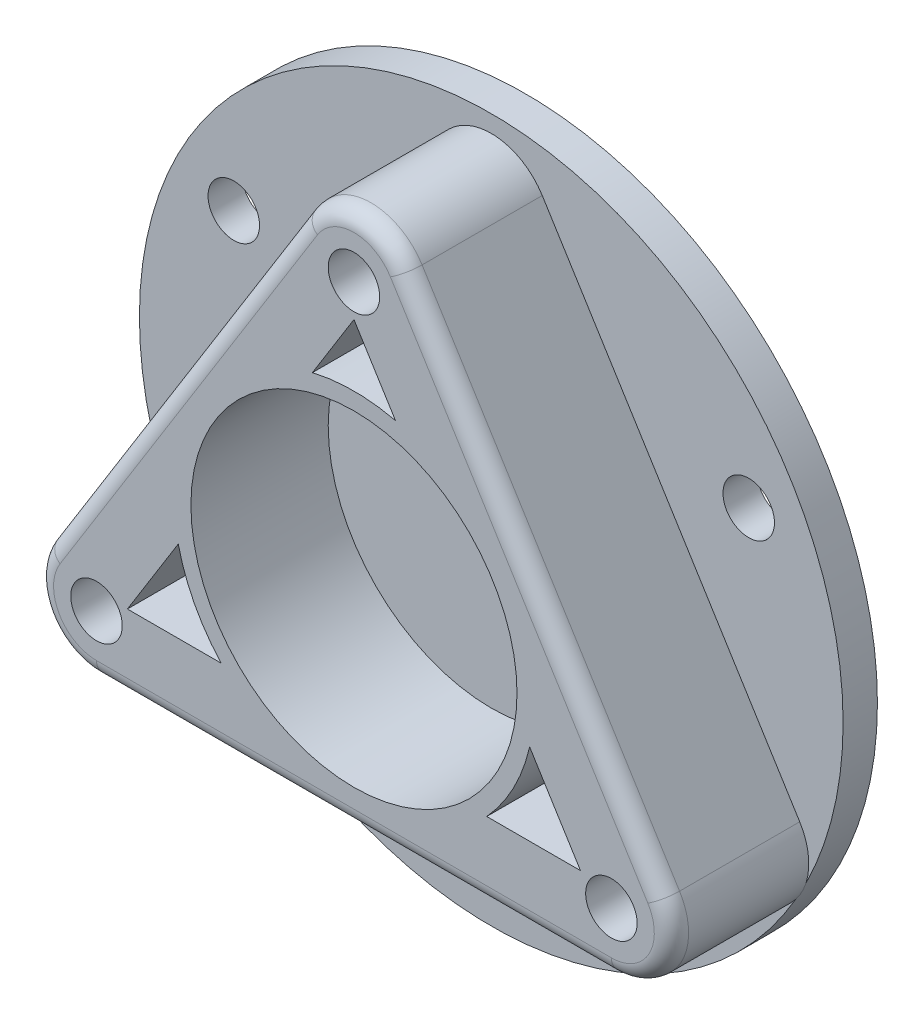
ISO-10303-21;
HEADER;
FILE_DESCRIPTION(('STEP AP214'),'2;1');
FILE_NAME('part.step','',(''),(''),'','','');
FILE_SCHEMA(('AUTOMOTIVE_DESIGN { 1 0 10303 214 1 1 1 1 }'));
ENDSEC;
DATA;
#1=APPLICATION_CONTEXT('core data for automotive mechanical design processes');
#2=APPLICATION_PROTOCOL_DEFINITION('international standard','automotive_design',2000,#1);
#3=PRODUCT_CONTEXT('',#1,'mechanical');
#4=PRODUCT('Part','Part','',(#3));
#5=PRODUCT_RELATED_PRODUCT_CATEGORY('part','',(#4));
#6=PRODUCT_DEFINITION_FORMATION('','',#4);
#7=PRODUCT_DEFINITION_CONTEXT('part definition',#1,'design');
#8=PRODUCT_DEFINITION('design','',#6,#7);
#9=PRODUCT_DEFINITION_SHAPE('','',#8);
#10=(LENGTH_UNIT() NAMED_UNIT(*) SI_UNIT(.MILLI.,.METRE.));
#11=(NAMED_UNIT(*) PLANE_ANGLE_UNIT() SI_UNIT($,.RADIAN.));
#12=(NAMED_UNIT(*) SI_UNIT($,.STERADIAN.) SOLID_ANGLE_UNIT());
#13=UNCERTAINTY_MEASURE_WITH_UNIT(LENGTH_MEASURE(1.E-05),#10,'distance_accuracy_value','');
#14=(GEOMETRIC_REPRESENTATION_CONTEXT(3) GLOBAL_UNCERTAINTY_ASSIGNED_CONTEXT((#13)) GLOBAL_UNIT_ASSIGNED_CONTEXT((#10,
#11,#12)) REPRESENTATION_CONTEXT('',''));
#15=CARTESIAN_POINT('',(0.,0.,0.));
#16=DIRECTION('',(0.,0.,1.));
#17=DIRECTION('',(1.,0.,0.));
#18=AXIS2_PLACEMENT_3D('',#15,#16,#17);
#19=CARTESIAN_POINT('',(0.,0.,10.));
#20=DIRECTION('',(0.,0.,1.));
#21=DIRECTION('',(1.,0.,0.));
#22=AXIS2_PLACEMENT_3D('',#19,#20,#21);
#23=PLANE('',#22);
#24=CARTESIAN_POINT('',(0.,0.,10.));
#25=DIRECTION('',(0.,0.,-1.));
#26=DIRECTION('',(1.,0.,0.));
#27=AXIS2_PLACEMENT_3D('',#24,#25,#26);
#28=CIRCLE('',#27,10.5);
#29=CARTESIAN_POINT('',(-2.42152963115498,10.2169562123677,10.));
#30=VERTEX_POINT('',#29);
#31=CARTESIAN_POINT('',(2.42152963115497,10.2169562123677,10.));
#32=VERTEX_POINT('',#31);
#33=EDGE_CURVE('E58',#30,#32,#28,.T.);
#34=ORIENTED_EDGE('',*,*,#33,.F.);
#35=DIRECTION('',(-0.528414751063838,-0.848986366709232,0.));
#36=VECTOR('',#35,1.);
#37=CARTESIAN_POINT('',(0.,14.10754715309,10.));
#38=LINE('',#37,#36);
#39=CARTESIAN_POINT('',(0.,14.10754715309,10.));
#40=VERTEX_POINT('',#39);
#41=EDGE_CURVE('E186',#40,#30,#38,.T.);
#42=ORIENTED_EDGE('',*,*,#41,.F.);
#43=DIRECTION('',(-0.528414751063837,0.848986366709232,0.));
#44=VECTOR('',#43,1.);
#45=CARTESIAN_POINT('',(2.42152963115497,10.2169562123677,10.));
#46=LINE('',#45,#44);
#47=EDGE_CURVE('E195',#32,#40,#46,.T.);
#48=ORIENTED_EDGE('',*,*,#47,.F.);
#49=EDGE_LOOP('',(#34,#42,#48));
#50=FACE_BOUND('',#49,.T.);
#51=CARTESIAN_POINT('',(0.,0.,10.));
#52=DIRECTION('',(0.,0.,-1.));
#53=DIRECTION('',(1.,0.,0.));
#54=AXIS2_PLACEMENT_3D('',#51,#52,#53);
#55=CIRCLE('',#54,10.5);
#56=CARTESIAN_POINT('',(-7.73563184232549,-7.1,10.));
#57=VERTEX_POINT('',#56);
#58=CARTESIAN_POINT('',(-10.2362390633066,-2.33867694195591,10.));
#59=VERTEX_POINT('',#58);
#60=EDGE_CURVE('E66',#57,#59,#55,.T.);
#61=ORIENTED_EDGE('',*,*,#60,.F.);
#62=DIRECTION('',(1.,0.,0.));
#63=VECTOR('',#62,1.);
#64=CARTESIAN_POINT('',(-13.1997181450768,-7.1,10.));
#65=LINE('',#64,#63);
#66=CARTESIAN_POINT('',(-13.1997181450768,-7.1,10.));
#67=VERTEX_POINT('',#66);
#68=EDGE_CURVE('E215',#67,#57,#65,.T.);
#69=ORIENTED_EDGE('',*,*,#68,.F.);
#70=DIRECTION('',(-0.528414751063837,-0.848986366709232,0.));
#71=VECTOR('',#70,1.);
#72=CARTESIAN_POINT('',(-10.2362390633066,-2.33867694195591,10.));
#73=LINE('',#72,#71);
#74=EDGE_CURVE('E223',#59,#67,#73,.T.);
#75=ORIENTED_EDGE('',*,*,#74,.F.);
#76=EDGE_LOOP('',(#61,#69,#75));
#77=FACE_BOUND('',#76,.T.);
#78=CARTESIAN_POINT('',(0.,0.,10.));
#79=DIRECTION('',(0.,0.,-1.));
#80=DIRECTION('',(1.,0.,0.));
#81=AXIS2_PLACEMENT_3D('',#78,#79,#80);
#82=CIRCLE('',#81,10.5);
#83=CARTESIAN_POINT('',(10.2362390633066,-2.33867694195592,10.));
#84=VERTEX_POINT('',#83);
#85=CARTESIAN_POINT('',(7.73563184232549,-7.1,10.));
#86=VERTEX_POINT('',#85);
#87=EDGE_CURVE('E212',#84,#86,#82,.T.);
#88=ORIENTED_EDGE('',*,*,#87,.F.);
#89=DIRECTION('',(-0.528414751063837,0.848986366709232,0.));
#90=VECTOR('',#89,1.);
#91=CARTESIAN_POINT('',(13.1997181450768,-7.1,10.));
#92=LINE('',#91,#90);
#93=CARTESIAN_POINT('',(13.1997181450768,-7.1,10.));
#94=VERTEX_POINT('',#93);
#95=EDGE_CURVE('E235',#94,#84,#92,.T.);
#96=ORIENTED_EDGE('',*,*,#95,.F.);
#97=DIRECTION('',(1.,0.,0.));
#98=VECTOR('',#97,1.);
#99=CARTESIAN_POINT('',(7.73563184232549,-7.1,10.));
#100=LINE('',#99,#98);
#101=EDGE_CURVE('E243',#86,#94,#100,.T.);
#102=ORIENTED_EDGE('',*,*,#101,.F.);
#103=EDGE_LOOP('',(#88,#96,#102));
#104=FACE_BOUND('',#103,.T.);
#105=DIRECTION('',(-0.528414751063837,0.848986366709232,0.));
#106=VECTOR('',#105,1.);
#107=CARTESIAN_POINT('',(2.12246591677308,17.3210368776596,10.));
#108=LINE('',#107,#106);
#109=CARTESIAN_POINT('',(17.1224659167731,-6.77896312234041,10.));
#110=VERTEX_POINT('',#109);
#111=CARTESIAN_POINT('',(2.12246591677308,17.3210368776596,10.));
#112=VERTEX_POINT('',#111);
#113=EDGE_CURVE('E344',#110,#112,#108,.T.);
#114=ORIENTED_EDGE('',*,*,#113,.T.);
#115=CARTESIAN_POINT('',(0.,16.,10.));
#116=DIRECTION('',(0.,0.,1.));
#117=DIRECTION('',(1.,0.,0.));
#118=AXIS2_PLACEMENT_3D('',#115,#116,#117);
#119=CIRCLE('',#118,2.5);
#120=CARTESIAN_POINT('',(-2.12246591677308,17.3210368776596,10.));
#121=VERTEX_POINT('',#120);
#122=EDGE_CURVE('E346',#112,#121,#119,.T.);
#123=ORIENTED_EDGE('',*,*,#122,.T.);
#124=DIRECTION('',(-0.528414751063838,-0.848986366709232,0.));
#125=VECTOR('',#124,1.);
#126=CARTESIAN_POINT('',(-17.1224659167731,-6.7789631223404,10.));
#127=LINE('',#126,#125);
#128=CARTESIAN_POINT('',(-17.1224659167731,-6.7789631223404,10.));
#129=VERTEX_POINT('',#128);
#130=EDGE_CURVE('E336',#121,#129,#127,.T.);
#131=ORIENTED_EDGE('',*,*,#130,.T.);
#132=CARTESIAN_POINT('',(-15.,-8.09999999999999,10.));
#133=DIRECTION('',(0.,0.,1.));
#134=DIRECTION('',(1.,0.,0.));
#135=AXIS2_PLACEMENT_3D('',#132,#133,#134);
#136=CIRCLE('',#135,2.5);
#137=CARTESIAN_POINT('',(-15.,-10.6,10.));
#138=VERTEX_POINT('',#137);
#139=EDGE_CURVE('E338',#129,#138,#136,.T.);
#140=ORIENTED_EDGE('',*,*,#139,.T.);
#141=DIRECTION('',(1.,0.,0.));
#142=VECTOR('',#141,1.);
#143=CARTESIAN_POINT('',(15.,-10.6,10.));
#144=LINE('',#143,#142);
#145=CARTESIAN_POINT('',(15.,-10.6,10.));
#146=VERTEX_POINT('',#145);
#147=EDGE_CURVE('E340',#138,#146,#144,.T.);
#148=ORIENTED_EDGE('',*,*,#147,.T.);
#149=CARTESIAN_POINT('',(15.,-8.1,10.));
#150=DIRECTION('',(0.,0.,1.));
#151=DIRECTION('',(1.,0.,0.));
#152=AXIS2_PLACEMENT_3D('',#149,#150,#151);
#153=CIRCLE('',#152,2.5);
#154=EDGE_CURVE('E342',#146,#110,#153,.T.);
#155=ORIENTED_EDGE('',*,*,#154,.T.);
#156=EDGE_LOOP('',(#114,#123,#131,#140,#148,#155));
#157=FACE_BOUND('',#156,.T.);
#158=CARTESIAN_POINT('',(0.,0.,10.));
#159=DIRECTION('',(0.,0.,1.));
#160=DIRECTION('',(1.,0.,0.));
#161=AXIS2_PLACEMENT_3D('',#158,#159,#160);
#162=CIRCLE('',#161,9.5);
#163=CARTESIAN_POINT('',(9.5,0.,10.));
#164=VERTEX_POINT('',#163);
#165=EDGE_CURVE('E295',#164,#164,#162,.T.);
#166=ORIENTED_EDGE('',*,*,#165,.F.);
#167=EDGE_LOOP('',(#166));
#168=FACE_BOUND('',#167,.T.);
#169=CARTESIAN_POINT('',(15.,-8.1,10.));
#170=DIRECTION('',(0.,0.,1.));
#171=DIRECTION('',(1.,0.,0.));
#172=AXIS2_PLACEMENT_3D('',#169,#170,#171);
#173=CIRCLE('',#172,1.5);
#174=CARTESIAN_POINT('',(16.5,-8.1,10.));
#175=VERTEX_POINT('',#174);
#176=EDGE_CURVE('E255',#175,#175,#173,.T.);
#177=ORIENTED_EDGE('',*,*,#176,.F.);
#178=EDGE_LOOP('',(#177));
#179=FACE_BOUND('',#178,.T.);
#180=CARTESIAN_POINT('',(-15.,-8.09999999999999,10.));
#181=DIRECTION('',(0.,0.,1.));
#182=DIRECTION('',(1.,0.,0.));
#183=AXIS2_PLACEMENT_3D('',#180,#181,#182);
#184=CIRCLE('',#183,1.5);
#185=CARTESIAN_POINT('',(-13.5,-8.09999999999999,10.));
#186=VERTEX_POINT('',#185);
#187=EDGE_CURVE('E252',#186,#186,#184,.T.);
#188=ORIENTED_EDGE('',*,*,#187,.F.);
#189=EDGE_LOOP('',(#188));
#190=FACE_BOUND('',#189,.T.);
#191=CARTESIAN_POINT('',(0.,16.,10.));
#192=DIRECTION('',(0.,0.,1.));
#193=DIRECTION('',(1.,0.,0.));
#194=AXIS2_PLACEMENT_3D('',#191,#192,#193);
#195=CIRCLE('',#194,1.5);
#196=CARTESIAN_POINT('',(1.5,16.,10.));
#197=VERTEX_POINT('',#196);
#198=EDGE_CURVE('E249',#197,#197,#195,.T.);
#199=ORIENTED_EDGE('',*,*,#198,.F.);
#200=EDGE_LOOP('',(#199));
#201=FACE_BOUND('',#200,.T.);
#202=ADVANCED_FACE('F41',(#50,#77,#104,#157,#168,#179,#190,#201),#23,.T.);
#203=CARTESIAN_POINT('',(0.,0.,10.));
#204=DIRECTION('',(0.,0.,-1.));
#205=DIRECTION('',(-1.,0.,0.));
#206=AXIS2_PLACEMENT_3D('',#203,#204,#205);
#207=CYLINDRICAL_SURFACE('',#206,9.5);
#208=ORIENTED_EDGE('',*,*,#165,.T.);
#209=EDGE_LOOP('',(#208));
#210=FACE_BOUND('',#209,.T.);
#211=CARTESIAN_POINT('',(0.,0.,2.));
#212=DIRECTION('',(0.,0.,1.));
#213=DIRECTION('',(1.,0.,0.));
#214=AXIS2_PLACEMENT_3D('',#211,#212,#213);
#215=CIRCLE('',#214,9.5);
#216=CARTESIAN_POINT('',(9.5,0.,2.));
#217=VERTEX_POINT('',#216);
#218=EDGE_CURVE('E320',#217,#217,#215,.F.);
#219=ORIENTED_EDGE('',*,*,#218,.T.);
#220=EDGE_LOOP('',(#219));
#221=FACE_BOUND('',#220,.T.);
#222=ADVANCED_FACE('F460',(#210,#221),#207,.F.);
#223=CARTESIAN_POINT('',(0.,0.,2.));
#224=DIRECTION('',(0.,0.,1.));
#225=DIRECTION('',(1.,0.,0.));
#226=AXIS2_PLACEMENT_3D('',#223,#224,#225);
#227=PLANE('',#226);
#228=ORIENTED_EDGE('',*,*,#218,.F.);
#229=EDGE_LOOP('',(#228));
#230=FACE_BOUND('',#229,.T.);
#231=ADVANCED_FACE('F456',(#230),#227,.T.);
#232=CARTESIAN_POINT('',(-15.,-8.09999999999999,2.));
#233=DIRECTION('',(0.,0.,1.));
#234=DIRECTION('',(1.,0.,0.));
#235=AXIS2_PLACEMENT_3D('',#232,#233,#234);
#236=PLANE('',#235);
#237=CARTESIAN_POINT('',(-15.,-8.09999999999999,2.));
#238=DIRECTION('',(0.,0.,1.));
#239=DIRECTION('',(1.,0.,0.));
#240=AXIS2_PLACEMENT_3D('',#237,#238,#239);
#241=CIRCLE('',#240,3.5);
#242=CARTESIAN_POINT('',(-18.3283043055652,-9.18276980450894,2.));
#243=VERTEX_POINT('',#242);
#244=CARTESIAN_POINT('',(-17.7308471345092,-10.2891719731312,2.));
#245=VERTEX_POINT('',#244);
#246=EDGE_CURVE('E263',#243,#245,#241,.T.);
#247=ORIENTED_EDGE('',*,*,#246,.F.);
#248=CARTESIAN_POINT('',(0.,0.,2.));
#249=DIRECTION('',(0.,0.,1.));
#250=DIRECTION('',(1.,0.,0.));
#251=AXIS2_PLACEMENT_3D('',#248,#249,#250);
#252=CIRCLE('',#251,20.5);
#253=EDGE_CURVE('E317',#243,#245,#252,.T.);
#254=ORIENTED_EDGE('',*,*,#253,.T.);
#255=EDGE_LOOP('',(#247,#254));
#256=FACE_BOUND('',#255,.T.);
#257=ADVANCED_FACE('F405',(#256),#236,.F.);
#258=CARTESIAN_POINT('',(15.,-8.1,2.));
#259=DIRECTION('',(0.,0.,1.));
#260=DIRECTION('',(1.,0.,0.));
#261=AXIS2_PLACEMENT_3D('',#258,#259,#260);
#262=CIRCLE('',#261,3.5);
#263=CARTESIAN_POINT('',(17.7308471345092,-10.2891719731312,2.));
#264=VERTEX_POINT('',#263);
#265=CARTESIAN_POINT('',(18.3283043055652,-9.18276980450894,2.));
#266=VERTEX_POINT('',#265);
#267=EDGE_CURVE('E271',#264,#266,#262,.T.);
#268=ORIENTED_EDGE('',*,*,#267,.F.);
#269=CARTESIAN_POINT('',(0.,0.,2.));
#270=DIRECTION('',(0.,0.,1.));
#271=DIRECTION('',(1.,0.,0.));
#272=AXIS2_PLACEMENT_3D('',#269,#270,#271);
#273=CIRCLE('',#272,20.5);
#274=EDGE_CURVE('E292',#264,#266,#273,.T.);
#275=ORIENTED_EDGE('',*,*,#274,.T.);
#276=EDGE_LOOP('',(#268,#275));
#277=FACE_BOUND('',#276,.T.);
#278=ADVANCED_FACE('F445',(#277),#236,.F.);
#279=CARTESIAN_POINT('',(0.,16.,58.3343563110134));
#280=DIRECTION('',(0.,0.,-1.));
#281=DIRECTION('',(-1.,0.,0.));
#282=AXIS2_PLACEMENT_3D('',#279,#280,#281);
#283=CYLINDRICAL_SURFACE('',#282,1.5);
#284=CARTESIAN_POINT('',(0.,16.,2.));
#285=DIRECTION('',(0.,0.,1.));
#286=DIRECTION('',(1.,0.,0.));
#287=AXIS2_PLACEMENT_3D('',#284,#285,#286);
#288=CIRCLE('',#287,1.5);
#289=CARTESIAN_POINT('',(1.5,16.,2.));
#290=VERTEX_POINT('',#289);
#291=EDGE_CURVE('E333',#290,#290,#288,.F.);
#292=ORIENTED_EDGE('',*,*,#291,.T.);
#293=EDGE_LOOP('',(#292));
#294=FACE_BOUND('',#293,.T.);
#295=ORIENTED_EDGE('',*,*,#198,.T.);
#296=EDGE_LOOP('',(#295));
#297=FACE_BOUND('',#296,.T.);
#298=ADVANCED_FACE('F447',(#294,#297),#283,.F.);
#299=CARTESIAN_POINT('',(-15.,-8.09999999999999,58.3343563110134));
#300=DIRECTION('',(0.,0.,-1.));
#301=DIRECTION('',(-1.,0.,0.));
#302=AXIS2_PLACEMENT_3D('',#299,#300,#301);
#303=CYLINDRICAL_SURFACE('',#302,1.5);
#304=CARTESIAN_POINT('',(-15.,-8.09999999999999,2.));
#305=DIRECTION('',(0.,0.,1.));
#306=DIRECTION('',(1.,0.,0.));
#307=AXIS2_PLACEMENT_3D('',#304,#305,#306);
#308=CIRCLE('',#307,1.5);
#309=CARTESIAN_POINT('',(-13.5,-8.09999999999999,2.));
#310=VERTEX_POINT('',#309);
#311=EDGE_CURVE('E330',#310,#310,#308,.F.);
#312=ORIENTED_EDGE('',*,*,#311,.T.);
#313=EDGE_LOOP('',(#312));
#314=FACE_BOUND('',#313,.T.);
#315=ORIENTED_EDGE('',*,*,#187,.T.);
#316=EDGE_LOOP('',(#315));
#317=FACE_BOUND('',#316,.T.);
#318=ADVANCED_FACE('F453',(#314,#317),#303,.F.);
#319=CARTESIAN_POINT('',(15.,-8.1,58.3343563110134));
#320=DIRECTION('',(0.,0.,-1.));
#321=DIRECTION('',(-1.,0.,0.));
#322=AXIS2_PLACEMENT_3D('',#319,#320,#321);
#323=CYLINDRICAL_SURFACE('',#322,1.5);
#324=CARTESIAN_POINT('',(15.,-8.1,2.));
#325=DIRECTION('',(0.,0.,1.));
#326=DIRECTION('',(1.,0.,0.));
#327=AXIS2_PLACEMENT_3D('',#324,#325,#326);
#328=CIRCLE('',#327,1.5);
#329=CARTESIAN_POINT('',(16.5,-8.1,2.));
#330=VERTEX_POINT('',#329);
#331=EDGE_CURVE('E327',#330,#330,#328,.F.);
#332=ORIENTED_EDGE('',*,*,#331,.T.);
#333=EDGE_LOOP('',(#332));
#334=FACE_BOUND('',#333,.T.);
#335=ORIENTED_EDGE('',*,*,#176,.T.);
#336=EDGE_LOOP('',(#335));
#337=FACE_BOUND('',#336,.T.);
#338=ADVANCED_FACE('F528',(#334,#337),#323,.F.);
#339=CARTESIAN_POINT('',(-2.97145228348231,17.8494516287234,58.3343563110134));
#340=DIRECTION('',(0.848986366709232,-0.528414751063838,0.));
#341=DIRECTION('',(0.528414751063838,0.848986366709232,0.));
#342=AXIS2_PLACEMENT_3D('',#339,#340,#341);
#343=PLANE('',#342);
#344=DIRECTION('',(0.,0.,-1.));
#345=VECTOR('',#344,1.);
#346=CARTESIAN_POINT('',(-17.9714522834823,-6.25054837127656,58.3343563110134));
#347=LINE('',#346,#345);
#348=CARTESIAN_POINT('',(-17.9714522834823,-6.25054837127656,9.));
#349=VERTEX_POINT('',#348);
#350=CARTESIAN_POINT('',(-17.9714522834823,-6.25054837127656,2.));
#351=VERTEX_POINT('',#350);
#352=EDGE_CURVE('E280',#349,#351,#347,.T.);
#353=ORIENTED_EDGE('',*,*,#352,.F.);
#354=DIRECTION('',(-0.528414751063838,-0.848986366709232,0.));
#355=VECTOR('',#354,1.);
#356=CARTESIAN_POINT('',(-2.97145228348231,17.8494516287234,9.));
#357=LINE('',#356,#355);
#358=CARTESIAN_POINT('',(-2.97145228348231,17.8494516287234,9.));
#359=VERTEX_POINT('',#358);
#360=EDGE_CURVE('E11',#349,#359,#357,.F.);
#361=ORIENTED_EDGE('',*,*,#360,.T.);
#362=DIRECTION('',(0.,0.,-1.));
#363=VECTOR('',#362,1.);
#364=CARTESIAN_POINT('',(-2.97145228348231,17.8494516287234,58.3343563110134));
#365=LINE('',#364,#363);
#366=CARTESIAN_POINT('',(-2.97145228348231,17.8494516287234,2.));
#367=VERTEX_POINT('',#366);
#368=EDGE_CURVE('E282',#359,#367,#365,.T.);
#369=ORIENTED_EDGE('',*,*,#368,.T.);
#370=DIRECTION('',(-0.528414751063838,-0.848986366709232,0.));
#371=VECTOR('',#370,1.);
#372=CARTESIAN_POINT('',(-2.97145228348231,17.8494516287234,2.));
#373=LINE('',#372,#371);
#374=EDGE_CURVE('E277',#367,#351,#373,.T.);
#375=ORIENTED_EDGE('',*,*,#374,.T.);
#376=EDGE_LOOP('',(#353,#361,#369,#375));
#377=FACE_BOUND('',#376,.T.);
#378=ADVANCED_FACE('F415',(#377),#343,.F.);
#379=CARTESIAN_POINT('',(0.,16.,58.3343563110134));
#380=DIRECTION('',(0.,0.,-1.));
#381=DIRECTION('',(-1.,0.,0.));
#382=AXIS2_PLACEMENT_3D('',#379,#380,#381);
#383=CYLINDRICAL_SURFACE('',#382,3.5);
#384=ORIENTED_EDGE('',*,*,#368,.F.);
#385=CARTESIAN_POINT('',(0.,16.,9.));
#386=DIRECTION('',(0.,0.,1.));
#387=DIRECTION('',(1.,0.,0.));
#388=AXIS2_PLACEMENT_3D('',#385,#386,#387);
#389=CIRCLE('',#388,3.5);
#390=CARTESIAN_POINT('',(2.97145228348231,17.8494516287234,9.));
#391=VERTEX_POINT('',#390);
#392=EDGE_CURVE('E349',#359,#391,#389,.F.);
#393=ORIENTED_EDGE('',*,*,#392,.T.);
#394=DIRECTION('',(0.,0.,-1.));
#395=VECTOR('',#394,1.);
#396=CARTESIAN_POINT('',(2.97145228348231,17.8494516287234,58.3343563110134));
#397=LINE('',#396,#395);
#398=CARTESIAN_POINT('',(2.97145228348231,17.8494516287234,2.));
#399=VERTEX_POINT('',#398);
#400=EDGE_CURVE('E284',#391,#399,#397,.T.);
#401=ORIENTED_EDGE('',*,*,#400,.T.);
#402=CARTESIAN_POINT('',(0.,16.,2.));
#403=DIRECTION('',(0.,0.,1.));
#404=DIRECTION('',(1.,0.,0.));
#405=AXIS2_PLACEMENT_3D('',#402,#403,#404);
#406=CIRCLE('',#405,3.5);
#407=EDGE_CURVE('E274',#399,#367,#406,.T.);
#408=ORIENTED_EDGE('',*,*,#407,.T.);
#409=EDGE_LOOP('',(#384,#393,#401,#408));
#410=FACE_BOUND('',#409,.T.);
#411=ADVANCED_FACE('F421',(#410),#383,.T.);
#412=CARTESIAN_POINT('',(17.9714522834823,-6.25054837127657,58.3343563110134));
#413=DIRECTION('',(-0.848986366709232,-0.528414751063837,0.));
#414=DIRECTION('',(0.528414751063837,-0.848986366709232,0.));
#415=AXIS2_PLACEMENT_3D('',#412,#413,#414);
#416=PLANE('',#415);
#417=ORIENTED_EDGE('',*,*,#400,.F.);
#418=DIRECTION('',(-0.528414751063837,0.848986366709232,0.));
#419=VECTOR('',#418,1.);
#420=CARTESIAN_POINT('',(17.9714522834823,-6.25054837127657,9.));
#421=LINE('',#420,#419);
#422=CARTESIAN_POINT('',(17.9714522834823,-6.25054837127657,9.));
#423=VERTEX_POINT('',#422);
#424=EDGE_CURVE('E352',#391,#423,#421,.F.);
#425=ORIENTED_EDGE('',*,*,#424,.T.);
#426=DIRECTION('',(0.,0.,-1.));
#427=VECTOR('',#426,1.);
#428=CARTESIAN_POINT('',(17.9714522834823,-6.25054837127657,58.3343563110134));
#429=LINE('',#428,#427);
#430=CARTESIAN_POINT('',(17.9714522834823,-6.25054837127657,2.));
#431=VERTEX_POINT('',#430);
#432=EDGE_CURVE('E286',#423,#431,#429,.T.);
#433=ORIENTED_EDGE('',*,*,#432,.T.);
#434=DIRECTION('',(-0.528414751063838,0.848986366709232,0.));
#435=VECTOR('',#434,1.);
#436=CARTESIAN_POINT('',(17.9714522834823,-6.25054837127657,2.));
#437=LINE('',#436,#435);
#438=EDGE_CURVE('E270',#431,#399,#437,.T.);
#439=ORIENTED_EDGE('',*,*,#438,.T.);
#440=EDGE_LOOP('',(#417,#425,#433,#439));
#441=FACE_BOUND('',#440,.T.);
#442=ADVANCED_FACE('F439',(#441),#416,.F.);
#443=CARTESIAN_POINT('',(15.,-8.1,58.3343563110134));
#444=DIRECTION('',(0.,0.,-1.));
#445=DIRECTION('',(-1.,0.,0.));
#446=AXIS2_PLACEMENT_3D('',#443,#444,#445);
#447=CYLINDRICAL_SURFACE('',#446,3.5);
#448=ORIENTED_EDGE('',*,*,#432,.F.);
#449=CARTESIAN_POINT('',(15.,-8.1,9.));
#450=DIRECTION('',(0.,0.,1.));
#451=DIRECTION('',(1.,0.,0.));
#452=AXIS2_PLACEMENT_3D('',#449,#450,#451);
#453=CIRCLE('',#452,3.5);
#454=CARTESIAN_POINT('',(15.,-11.6,9.));
#455=VERTEX_POINT('',#454);
#456=EDGE_CURVE('E354',#423,#455,#453,.F.);
#457=ORIENTED_EDGE('',*,*,#456,.T.);
#458=DIRECTION('',(0.,0.,-1.));
#459=VECTOR('',#458,1.);
#460=CARTESIAN_POINT('',(15.,-11.6,58.3343563110134));
#461=LINE('',#460,#459);
#462=CARTESIAN_POINT('',(15.,-11.6,2.));
#463=VERTEX_POINT('',#462);
#464=EDGE_CURVE('E288',#455,#463,#461,.T.);
#465=ORIENTED_EDGE('',*,*,#464,.T.);
#466=EDGE_CURVE('E267',#463,#264,#262,.T.);
#467=ORIENTED_EDGE('',*,*,#466,.T.);
#468=ORIENTED_EDGE('',*,*,#267,.T.);
#469=EDGE_CURVE('E266',#266,#431,#262,.T.);
#470=ORIENTED_EDGE('',*,*,#469,.T.);
#471=EDGE_LOOP('',(#448,#457,#465,#467,#468,#470));
#472=FACE_BOUND('',#471,.T.);
#473=ADVANCED_FACE('F442',(#472),#447,.T.);
#474=CARTESIAN_POINT('',(-15.,-11.6,58.3343563110134));
#475=DIRECTION('',(0.,1.,0.));
#476=DIRECTION('',(-1.,0.,0.));
#477=AXIS2_PLACEMENT_3D('',#474,#475,#476);
#478=PLANE('',#477);
#479=ORIENTED_EDGE('',*,*,#464,.F.);
#480=DIRECTION('',(1.,0.,0.));
#481=VECTOR('',#480,1.);
#482=CARTESIAN_POINT('',(-15.,-11.6,9.));
#483=LINE('',#482,#481);
#484=CARTESIAN_POINT('',(-15.,-11.6,9.));
#485=VERTEX_POINT('',#484);
#486=EDGE_CURVE('E356',#455,#485,#483,.F.);
#487=ORIENTED_EDGE('',*,*,#486,.T.);
#488=DIRECTION('',(0.,0.,-1.));
#489=VECTOR('',#488,1.);
#490=CARTESIAN_POINT('',(-15.,-11.6,58.3343563110134));
#491=LINE('',#490,#489);
#492=CARTESIAN_POINT('',(-15.,-11.6,2.));
#493=VERTEX_POINT('',#492);
#494=EDGE_CURVE('E290',#485,#493,#491,.T.);
#495=ORIENTED_EDGE('',*,*,#494,.T.);
#496=DIRECTION('',(1.,0.,0.));
#497=VECTOR('',#496,1.);
#498=CARTESIAN_POINT('',(-15.,-11.6,2.));
#499=LINE('',#498,#497);
#500=EDGE_CURVE('E262',#493,#463,#499,.T.);
#501=ORIENTED_EDGE('',*,*,#500,.T.);
#502=EDGE_LOOP('',(#479,#487,#495,#501));
#503=FACE_BOUND('',#502,.T.);
#504=ADVANCED_FACE('F386',(#503),#478,.F.);
#505=CARTESIAN_POINT('',(-15.,-8.09999999999999,58.3343563110134));
#506=DIRECTION('',(0.,0.,-1.));
#507=DIRECTION('',(-1.,0.,0.));
#508=AXIS2_PLACEMENT_3D('',#505,#506,#507);
#509=CYLINDRICAL_SURFACE('',#508,3.5);
#510=ORIENTED_EDGE('',*,*,#494,.F.);
#511=CARTESIAN_POINT('',(-15.,-8.09999999999999,9.));
#512=DIRECTION('',(0.,0.,1.));
#513=DIRECTION('',(1.,0.,0.));
#514=AXIS2_PLACEMENT_3D('',#511,#512,#513);
#515=CIRCLE('',#514,3.5);
#516=EDGE_CURVE('E50',#485,#349,#515,.F.);
#517=ORIENTED_EDGE('',*,*,#516,.T.);
#518=ORIENTED_EDGE('',*,*,#352,.T.);
#519=EDGE_CURVE('E259',#351,#243,#241,.T.);
#520=ORIENTED_EDGE('',*,*,#519,.T.);
#521=ORIENTED_EDGE('',*,*,#246,.T.);
#522=EDGE_CURVE('E258',#245,#493,#241,.T.);
#523=ORIENTED_EDGE('',*,*,#522,.T.);
#524=EDGE_LOOP('',(#510,#517,#518,#520,#521,#523));
#525=FACE_BOUND('',#524,.T.);
#526=ADVANCED_FACE('F390',(#525),#509,.T.);
#527=CARTESIAN_POINT('',(0.,-16.,2.));
#528=DIRECTION('',(0.,0.,-1.));
#529=DIRECTION('',(-1.,0.,0.));
#530=AXIS2_PLACEMENT_3D('',#527,#528,#529);
#531=CYLINDRICAL_SURFACE('',#530,1.5);
#532=CARTESIAN_POINT('',(0.,-16.,2.));
#533=DIRECTION('',(0.,0.,1.));
#534=DIRECTION('',(1.,0.,0.));
#535=AXIS2_PLACEMENT_3D('',#532,#533,#534);
#536=CIRCLE('',#535,1.5);
#537=CARTESIAN_POINT('',(1.5,-16.,2.));
#538=VERTEX_POINT('',#537);
#539=EDGE_CURVE('E305',#538,#538,#536,.T.);
#540=ORIENTED_EDGE('',*,*,#539,.T.);
#541=EDGE_LOOP('',(#540));
#542=FACE_BOUND('',#541,.T.);
#543=CARTESIAN_POINT('',(0.,-16.,0.));
#544=DIRECTION('',(0.,0.,1.));
#545=DIRECTION('',(1.,0.,0.));
#546=AXIS2_PLACEMENT_3D('',#543,#544,#545);
#547=CIRCLE('',#546,1.5);
#548=CARTESIAN_POINT('',(1.5,-16.,0.));
#549=VERTEX_POINT('',#548);
#550=EDGE_CURVE('E302',#549,#549,#547,.T.);
#551=ORIENTED_EDGE('',*,*,#550,.F.);
#552=EDGE_LOOP('',(#551));
#553=FACE_BOUND('',#552,.T.);
#554=ADVANCED_FACE('F475',(#542,#553),#531,.F.);
#555=CARTESIAN_POINT('',(-15.,8.09999999999999,2.));
#556=DIRECTION('',(0.,0.,-1.));
#557=DIRECTION('',(-1.,0.,0.));
#558=AXIS2_PLACEMENT_3D('',#555,#556,#557);
#559=CYLINDRICAL_SURFACE('',#558,1.5);
#560=CARTESIAN_POINT('',(-15.,8.09999999999999,2.));
#561=DIRECTION('',(0.,0.,1.));
#562=DIRECTION('',(-1.,0.,0.));
#563=AXIS2_PLACEMENT_3D('',#560,#561,#562);
#564=CIRCLE('',#563,1.5);
#565=CARTESIAN_POINT('',(-16.5,8.09999999999999,2.));
#566=VERTEX_POINT('',#565);
#567=EDGE_CURVE('E299',#566,#566,#564,.T.);
#568=ORIENTED_EDGE('',*,*,#567,.T.);
#569=EDGE_LOOP('',(#568));
#570=FACE_BOUND('',#569,.T.);
#571=CARTESIAN_POINT('',(-15.,8.09999999999999,0.));
#572=DIRECTION('',(0.,0.,1.));
#573=DIRECTION('',(-1.,0.,0.));
#574=AXIS2_PLACEMENT_3D('',#571,#572,#573);
#575=CIRCLE('',#574,1.5);
#576=CARTESIAN_POINT('',(-16.5,8.09999999999999,0.));
#577=VERTEX_POINT('',#576);
#578=EDGE_CURVE('E298',#577,#577,#575,.T.);
#579=ORIENTED_EDGE('',*,*,#578,.F.);
#580=EDGE_LOOP('',(#579));
#581=FACE_BOUND('',#580,.T.);
#582=ADVANCED_FACE('F471',(#570,#581),#559,.F.);
#583=CARTESIAN_POINT('',(15.,8.1,2.));
#584=DIRECTION('',(0.,0.,-1.));
#585=DIRECTION('',(-1.,0.,0.));
#586=AXIS2_PLACEMENT_3D('',#583,#584,#585);
#587=CYLINDRICAL_SURFACE('',#586,1.5);
#588=CARTESIAN_POINT('',(15.,8.1,2.));
#589=DIRECTION('',(0.,0.,1.));
#590=DIRECTION('',(1.,0.,0.));
#591=AXIS2_PLACEMENT_3D('',#588,#589,#590);
#592=CIRCLE('',#591,1.5);
#593=CARTESIAN_POINT('',(16.5,8.1,2.));
#594=VERTEX_POINT('',#593);
#595=EDGE_CURVE('E311',#594,#594,#592,.T.);
#596=ORIENTED_EDGE('',*,*,#595,.T.);
#597=EDGE_LOOP('',(#596));
#598=FACE_BOUND('',#597,.T.);
#599=CARTESIAN_POINT('',(15.,8.1,0.));
#600=DIRECTION('',(0.,0.,1.));
#601=DIRECTION('',(1.,0.,0.));
#602=AXIS2_PLACEMENT_3D('',#599,#600,#601);
#603=CIRCLE('',#602,1.5);
#604=CARTESIAN_POINT('',(16.5,8.1,0.));
#605=VERTEX_POINT('',#604);
#606=EDGE_CURVE('E308',#605,#605,#603,.T.);
#607=ORIENTED_EDGE('',*,*,#606,.F.);
#608=EDGE_LOOP('',(#607));
#609=FACE_BOUND('',#608,.T.);
#610=ADVANCED_FACE('F474',(#598,#609),#587,.F.);
#611=CARTESIAN_POINT('',(0.,0.,0.));
#612=DIRECTION('',(0.,0.,1.));
#613=DIRECTION('',(1.,0.,0.));
#614=AXIS2_PLACEMENT_3D('',#611,#612,#613);
#615=PLANE('',#614);
#616=CARTESIAN_POINT('',(0.,0.,0.));
#617=DIRECTION('',(0.,0.,1.));
#618=DIRECTION('',(1.,0.,0.));
#619=AXIS2_PLACEMENT_3D('',#616,#617,#618);
#620=CIRCLE('',#619,20.5);
#621=CARTESIAN_POINT('',(20.5,0.,0.));
#622=VERTEX_POINT('',#621);
#623=EDGE_CURVE('E314',#622,#622,#620,.T.);
#624=ORIENTED_EDGE('',*,*,#623,.F.);
#625=EDGE_LOOP('',(#624));
#626=FACE_BOUND('',#625,.T.);
#627=ORIENTED_EDGE('',*,*,#606,.T.);
#628=EDGE_LOOP('',(#627));
#629=FACE_BOUND('',#628,.T.);
#630=ORIENTED_EDGE('',*,*,#550,.T.);
#631=EDGE_LOOP('',(#630));
#632=FACE_BOUND('',#631,.T.);
#633=ORIENTED_EDGE('',*,*,#578,.T.);
#634=EDGE_LOOP('',(#633));
#635=FACE_BOUND('',#634,.T.);
#636=ADVANCED_FACE('F482',(#626,#629,#632,#635),#615,.F.);
#637=CARTESIAN_POINT('',(0.,0.,2.));
#638=DIRECTION('',(0.,0.,-1.));
#639=DIRECTION('',(-1.,0.,0.));
#640=AXIS2_PLACEMENT_3D('',#637,#638,#639);
#641=CYLINDRICAL_SURFACE('',#640,20.5);
#642=ORIENTED_EDGE('',*,*,#253,.F.);
#643=EDGE_CURVE('E322',#266,#243,#252,.T.);
#644=ORIENTED_EDGE('',*,*,#643,.F.);
#645=ORIENTED_EDGE('',*,*,#274,.F.);
#646=EDGE_CURVE('E321',#245,#264,#252,.T.);
#647=ORIENTED_EDGE('',*,*,#646,.F.);
#648=EDGE_LOOP('',(#642,#644,#645,#647));
#649=FACE_BOUND('',#648,.T.);
#650=ORIENTED_EDGE('',*,*,#623,.T.);
#651=EDGE_LOOP('',(#650));
#652=FACE_BOUND('',#651,.T.);
#653=ADVANCED_FACE('F402',(#649,#652),#641,.T.);
#654=ORIENTED_EDGE('',*,*,#438,.F.);
#655=ORIENTED_EDGE('',*,*,#469,.F.);
#656=ORIENTED_EDGE('',*,*,#643,.T.);
#657=ORIENTED_EDGE('',*,*,#519,.F.);
#658=ORIENTED_EDGE('',*,*,#374,.F.);
#659=ORIENTED_EDGE('',*,*,#407,.F.);
#660=EDGE_LOOP('',(#654,#655,#656,#657,#658,#659));
#661=FACE_BOUND('',#660,.T.);
#662=ORIENTED_EDGE('',*,*,#595,.F.);
#663=EDGE_LOOP('',(#662));
#664=FACE_BOUND('',#663,.T.);
#665=ORIENTED_EDGE('',*,*,#567,.F.);
#666=EDGE_LOOP('',(#665));
#667=FACE_BOUND('',#666,.T.);
#668=ADVANCED_FACE('F410',(#661,#664,#667),#227,.T.);
#669=ORIENTED_EDGE('',*,*,#539,.F.);
#670=EDGE_LOOP('',(#669));
#671=FACE_BOUND('',#670,.T.);
#672=ORIENTED_EDGE('',*,*,#646,.T.);
#673=ORIENTED_EDGE('',*,*,#466,.F.);
#674=ORIENTED_EDGE('',*,*,#500,.F.);
#675=ORIENTED_EDGE('',*,*,#522,.F.);
#676=EDGE_LOOP('',(#672,#673,#674,#675));
#677=FACE_BOUND('',#676,.T.);
#678=ADVANCED_FACE('F397',(#671,#677),#227,.T.);
#679=ORIENTED_EDGE('',*,*,#331,.F.);
#680=EDGE_LOOP('',(#679));
#681=FACE_BOUND('',#680,.T.);
#682=ADVANCED_FACE('F514',(#681),#227,.T.);
#683=ORIENTED_EDGE('',*,*,#311,.F.);
#684=EDGE_LOOP('',(#683));
#685=FACE_BOUND('',#684,.T.);
#686=ADVANCED_FACE('F508',(#685),#227,.T.);
#687=ORIENTED_EDGE('',*,*,#291,.F.);
#688=EDGE_LOOP('',(#687));
#689=FACE_BOUND('',#688,.T.);
#690=ADVANCED_FACE('F486',(#689),#227,.T.);
#691=CARTESIAN_POINT('',(0.,-10.6,9.));
#692=DIRECTION('',(-1.,0.,0.));
#693=DIRECTION('',(0.,-1.,0.));
#694=AXIS2_PLACEMENT_3D('',#691,#692,#693);
#695=CYLINDRICAL_SURFACE('',#694,1.);
#696=CARTESIAN_POINT('',(-15.,-10.6,9.));
#697=DIRECTION('',(-1.,0.,0.));
#698=DIRECTION('',(0.,0.,1.));
#699=AXIS2_PLACEMENT_3D('',#696,#697,#698);
#700=CIRCLE('',#699,1.);
#701=EDGE_CURVE('E367',#485,#138,#700,.T.);
#702=ORIENTED_EDGE('',*,*,#701,.F.);
#703=ORIENTED_EDGE('',*,*,#486,.F.);
#704=CARTESIAN_POINT('',(15.,-10.6,9.));
#705=DIRECTION('',(1.,0.,0.));
#706=DIRECTION('',(0.,0.,-1.));
#707=AXIS2_PLACEMENT_3D('',#704,#705,#706);
#708=CIRCLE('',#707,1.);
#709=EDGE_CURVE('E45',#146,#455,#708,.T.);
#710=ORIENTED_EDGE('',*,*,#709,.F.);
#711=ORIENTED_EDGE('',*,*,#147,.F.);
#712=EDGE_LOOP('',(#702,#703,#710,#711));
#713=FACE_BOUND('',#712,.T.);
#714=ADVANCED_FACE('F43',(#713),#695,.T.);
#715=CARTESIAN_POINT('',(15.,-8.1,9.));
#716=DIRECTION('',(0.,0.,1.));
#717=DIRECTION('',(1.,0.,0.));
#718=AXIS2_PLACEMENT_3D('',#715,#716,#717);
#719=TOROIDAL_SURFACE('',#718,2.5,1.);
#720=ORIENTED_EDGE('',*,*,#709,.T.);
#721=ORIENTED_EDGE('',*,*,#456,.F.);
#722=CARTESIAN_POINT('',(17.1224659167731,-6.77896312234041,9.));
#723=DIRECTION('',(-0.528414751063838,0.848986366709232,0.));
#724=DIRECTION('',(-0.848986366709232,-0.528414751063838,0.));
#725=AXIS2_PLACEMENT_3D('',#722,#723,#724);
#726=CIRCLE('',#725,1.);
#727=EDGE_CURVE('E365',#110,#423,#726,.T.);
#728=ORIENTED_EDGE('',*,*,#727,.F.);
#729=ORIENTED_EDGE('',*,*,#154,.F.);
#730=EDGE_LOOP('',(#720,#721,#728,#729));
#731=FACE_BOUND('',#730,.T.);
#732=ADVANCED_FACE('F378',(#731),#719,.T.);
#733=CARTESIAN_POINT('',(-15.,-8.09999999999999,9.));
#734=DIRECTION('',(0.,0.,1.));
#735=DIRECTION('',(1.,0.,0.));
#736=AXIS2_PLACEMENT_3D('',#733,#734,#735);
#737=TOROIDAL_SURFACE('',#736,2.5,1.);
#738=ORIENTED_EDGE('',*,*,#701,.T.);
#739=ORIENTED_EDGE('',*,*,#139,.F.);
#740=CARTESIAN_POINT('',(-17.1224659167731,-6.7789631223404,9.));
#741=DIRECTION('',(0.528414751063838,0.848986366709232,0.));
#742=DIRECTION('',(-0.848986366709232,0.528414751063838,0.));
#743=AXIS2_PLACEMENT_3D('',#740,#741,#742);
#744=CIRCLE('',#743,1.);
#745=EDGE_CURVE('E362',#349,#129,#744,.T.);
#746=ORIENTED_EDGE('',*,*,#745,.F.);
#747=ORIENTED_EDGE('',*,*,#516,.F.);
#748=EDGE_LOOP('',(#738,#739,#746,#747));
#749=FACE_BOUND('',#748,.T.);
#750=ADVANCED_FACE('F498',(#749),#737,.T.);
#751=CARTESIAN_POINT('',(9.30033663071309,5.78859126392931,9.));
#752=DIRECTION('',(0.528414751063837,-0.848986366709232,0.));
#753=DIRECTION('',(0.848986366709232,0.528414751063837,0.));
#754=AXIS2_PLACEMENT_3D('',#751,#752,#753);
#755=CYLINDRICAL_SURFACE('',#754,1.);
#756=ORIENTED_EDGE('',*,*,#727,.T.);
#757=ORIENTED_EDGE('',*,*,#424,.F.);
#758=CARTESIAN_POINT('',(2.12246591677308,17.3210368776596,9.));
#759=DIRECTION('',(-0.528414751063837,0.848986366709232,0.));
#760=DIRECTION('',(-0.848986366709232,-0.528414751063837,0.));
#761=AXIS2_PLACEMENT_3D('',#758,#759,#760);
#762=CIRCLE('',#761,1.);
#763=EDGE_CURVE('E360',#112,#391,#762,.T.);
#764=ORIENTED_EDGE('',*,*,#763,.F.);
#765=ORIENTED_EDGE('',*,*,#113,.F.);
#766=EDGE_LOOP('',(#756,#757,#764,#765));
#767=FACE_BOUND('',#766,.T.);
#768=ADVANCED_FACE('F436',(#767),#755,.T.);
#769=CARTESIAN_POINT('',(-9.30033663071309,5.78859126392932,9.));
#770=DIRECTION('',(0.528414751063838,0.848986366709232,0.));
#771=DIRECTION('',(-0.848986366709232,0.528414751063838,0.));
#772=AXIS2_PLACEMENT_3D('',#769,#770,#771);
#773=CYLINDRICAL_SURFACE('',#772,1.);
#774=ORIENTED_EDGE('',*,*,#745,.T.);
#775=ORIENTED_EDGE('',*,*,#130,.F.);
#776=CARTESIAN_POINT('',(-2.12246591677308,17.3210368776596,9.));
#777=DIRECTION('',(0.528414751063838,0.848986366709232,0.));
#778=DIRECTION('',(-0.848986366709232,0.528414751063838,0.));
#779=AXIS2_PLACEMENT_3D('',#776,#777,#778);
#780=CIRCLE('',#779,1.);
#781=EDGE_CURVE('E207',#359,#121,#780,.T.);
#782=ORIENTED_EDGE('',*,*,#781,.F.);
#783=ORIENTED_EDGE('',*,*,#360,.F.);
#784=EDGE_LOOP('',(#774,#775,#782,#783));
#785=FACE_BOUND('',#784,.T.);
#786=ADVANCED_FACE('F431',(#785),#773,.T.);
#787=CARTESIAN_POINT('',(0.,16.,9.));
#788=DIRECTION('',(0.,0.,1.));
#789=DIRECTION('',(1.,0.,0.));
#790=AXIS2_PLACEMENT_3D('',#787,#788,#789);
#791=TOROIDAL_SURFACE('',#790,2.5,1.);
#792=ORIENTED_EDGE('',*,*,#763,.T.);
#793=ORIENTED_EDGE('',*,*,#392,.F.);
#794=ORIENTED_EDGE('',*,*,#781,.T.);
#795=ORIENTED_EDGE('',*,*,#122,.F.);
#796=EDGE_LOOP('',(#792,#793,#794,#795));
#797=FACE_BOUND('',#796,.T.);
#798=ADVANCED_FACE('F425',(#797),#791,.T.);
#799=CARTESIAN_POINT('',(0.,0.,-5.24751242751445));
#800=DIRECTION('',(0.,0.,1.));
#801=DIRECTION('',(1.,0.,0.));
#802=AXIS2_PLACEMENT_3D('',#799,#800,#801);
#803=CYLINDRICAL_SURFACE('',#802,10.5);
#804=CARTESIAN_POINT('',(0.,0.,2.));
#805=DIRECTION('',(0.,0.,1.));
#806=DIRECTION('',(1.,0.,0.));
#807=AXIS2_PLACEMENT_3D('',#804,#805,#806);
#808=CIRCLE('',#807,10.5);
#809=CARTESIAN_POINT('',(7.73563184232549,-7.1,2.));
#810=VERTEX_POINT('',#809);
#811=CARTESIAN_POINT('',(10.2362390633066,-2.33867694195592,2.));
#812=VERTEX_POINT('',#811);
#813=EDGE_CURVE('E231',#810,#812,#808,.T.);
#814=ORIENTED_EDGE('',*,*,#813,.T.);
#815=DIRECTION('',(0.,0.,1.));
#816=VECTOR('',#815,1.);
#817=CARTESIAN_POINT('',(10.2362390633066,-2.33867694195592,-5.24751242751445));
#818=LINE('',#817,#816);
#819=EDGE_CURVE('E238',#812,#84,#818,.T.);
#820=ORIENTED_EDGE('',*,*,#819,.T.);
#821=ORIENTED_EDGE('',*,*,#87,.T.);
#822=DIRECTION('',(0.,0.,1.));
#823=VECTOR('',#822,1.);
#824=CARTESIAN_POINT('',(7.73563184232549,-7.1,-5.24751242751445));
#825=LINE('',#824,#823);
#826=EDGE_CURVE('E232',#810,#86,#825,.T.);
#827=ORIENTED_EDGE('',*,*,#826,.F.);
#828=EDGE_LOOP('',(#814,#820,#821,#827));
#829=FACE_BOUND('',#828,.T.);
#830=ADVANCED_FACE('F493',(#829),#803,.T.);
#831=CARTESIAN_POINT('',(13.1997181450768,-7.1,-5.24751242751445));
#832=DIRECTION('',(0.848986366709232,0.528414751063837,0.));
#833=DIRECTION('',(-0.528414751063838,0.848986366709232,0.));
#834=AXIS2_PLACEMENT_3D('',#831,#832,#833);
#835=PLANE('',#834);
#836=DIRECTION('',(0.528414751063838,-0.848986366709232,0.));
#837=VECTOR('',#836,1.);
#838=CARTESIAN_POINT('',(13.1997181450768,-7.1,2.));
#839=LINE('',#838,#837);
#840=CARTESIAN_POINT('',(13.1997181450768,-7.1,2.));
#841=VERTEX_POINT('',#840);
#842=EDGE_CURVE('E240',#812,#841,#839,.T.);
#843=ORIENTED_EDGE('',*,*,#842,.T.);
#844=DIRECTION('',(0.,0.,1.));
#845=VECTOR('',#844,1.);
#846=CARTESIAN_POINT('',(13.1997181450768,-7.1,-5.24751242751445));
#847=LINE('',#846,#845);
#848=EDGE_CURVE('E236',#841,#94,#847,.T.);
#849=ORIENTED_EDGE('',*,*,#848,.T.);
#850=ORIENTED_EDGE('',*,*,#95,.T.);
#851=ORIENTED_EDGE('',*,*,#819,.F.);
#852=EDGE_LOOP('',(#843,#849,#850,#851));
#853=FACE_BOUND('',#852,.T.);
#854=ADVANCED_FACE('F543',(#853),#835,.F.);
#855=CARTESIAN_POINT('',(7.73563184232549,-7.1,-5.24751242751445));
#856=DIRECTION('',(0.,-1.,0.));
#857=DIRECTION('',(1.,0.,0.));
#858=AXIS2_PLACEMENT_3D('',#855,#856,#857);
#859=PLANE('',#858);
#860=DIRECTION('',(-1.,0.,0.));
#861=VECTOR('',#860,1.);
#862=CARTESIAN_POINT('',(7.73563184232549,-7.1,2.));
#863=LINE('',#862,#861);
#864=EDGE_CURVE('E229',#841,#810,#863,.T.);
#865=ORIENTED_EDGE('',*,*,#864,.T.);
#866=ORIENTED_EDGE('',*,*,#826,.T.);
#867=ORIENTED_EDGE('',*,*,#101,.T.);
#868=ORIENTED_EDGE('',*,*,#848,.F.);
#869=EDGE_LOOP('',(#865,#866,#867,#868));
#870=FACE_BOUND('',#869,.T.);
#871=ADVANCED_FACE('F541',(#870),#859,.F.);
#872=CARTESIAN_POINT('',(0.,0.,2.));
#873=DIRECTION('',(0.,0.,1.));
#874=DIRECTION('',(1.,0.,0.));
#875=AXIS2_PLACEMENT_3D('',#872,#873,#874);
#876=PLANE('',#875);
#877=ORIENTED_EDGE('',*,*,#813,.F.);
#878=ORIENTED_EDGE('',*,*,#864,.F.);
#879=ORIENTED_EDGE('',*,*,#842,.F.);
#880=EDGE_LOOP('',(#877,#878,#879));
#881=FACE_BOUND('',#880,.T.);
#882=ADVANCED_FACE('F537',(#881),#876,.T.);
#883=CARTESIAN_POINT('',(0.,0.,-5.24751242751445));
#884=DIRECTION('',(0.,0.,1.));
#885=DIRECTION('',(1.,0.,0.));
#886=AXIS2_PLACEMENT_3D('',#883,#884,#885);
#887=CYLINDRICAL_SURFACE('',#886,10.5);
#888=CARTESIAN_POINT('',(0.,0.,2.));
#889=DIRECTION('',(0.,0.,1.));
#890=DIRECTION('',(1.,0.,0.));
#891=AXIS2_PLACEMENT_3D('',#888,#889,#890);
#892=CIRCLE('',#891,10.5);
#893=CARTESIAN_POINT('',(-10.2362390633066,-2.33867694195591,2.));
#894=VERTEX_POINT('',#893);
#895=CARTESIAN_POINT('',(-7.73563184232549,-7.1,2.));
#896=VERTEX_POINT('',#895);
#897=EDGE_CURVE('E211',#894,#896,#892,.T.);
#898=ORIENTED_EDGE('',*,*,#897,.T.);
#899=DIRECTION('',(0.,0.,1.));
#900=VECTOR('',#899,1.);
#901=CARTESIAN_POINT('',(-7.73563184232549,-7.1,-5.24751242751445));
#902=LINE('',#901,#900);
#903=EDGE_CURVE('E218',#896,#57,#902,.T.);
#904=ORIENTED_EDGE('',*,*,#903,.T.);
#905=ORIENTED_EDGE('',*,*,#60,.T.);
#906=DIRECTION('',(0.,0.,1.));
#907=VECTOR('',#906,1.);
#908=CARTESIAN_POINT('',(-10.2362390633066,-2.33867694195591,-5.24751242751445));
#909=LINE('',#908,#907);
#910=EDGE_CURVE('E213',#894,#59,#909,.T.);
#911=ORIENTED_EDGE('',*,*,#910,.F.);
#912=EDGE_LOOP('',(#898,#904,#905,#911));
#913=FACE_BOUND('',#912,.T.);
#914=ADVANCED_FACE('F540',(#913),#887,.T.);
#915=CARTESIAN_POINT('',(-13.1997181450768,-7.1,-5.24751242751445));
#916=DIRECTION('',(0.,-1.,0.));
#917=DIRECTION('',(1.,0.,0.));
#918=AXIS2_PLACEMENT_3D('',#915,#916,#917);
#919=PLANE('',#918);
#920=DIRECTION('',(-1.,0.,0.));
#921=VECTOR('',#920,1.);
#922=CARTESIAN_POINT('',(-13.1997181450768,-7.1,2.));
#923=LINE('',#922,#921);
#924=CARTESIAN_POINT('',(-13.1997181450768,-7.1,2.));
#925=VERTEX_POINT('',#924);
#926=EDGE_CURVE('E220',#896,#925,#923,.T.);
#927=ORIENTED_EDGE('',*,*,#926,.T.);
#928=DIRECTION('',(0.,0.,1.));
#929=VECTOR('',#928,1.);
#930=CARTESIAN_POINT('',(-13.1997181450768,-7.1,-5.24751242751445));
#931=LINE('',#930,#929);
#932=EDGE_CURVE('E216',#925,#67,#931,.T.);
#933=ORIENTED_EDGE('',*,*,#932,.T.);
#934=ORIENTED_EDGE('',*,*,#68,.T.);
#935=ORIENTED_EDGE('',*,*,#903,.F.);
#936=EDGE_LOOP('',(#927,#933,#934,#935));
#937=FACE_BOUND('',#936,.T.);
#938=ADVANCED_FACE('F558',(#937),#919,.F.);
#939=CARTESIAN_POINT('',(-10.2362390633066,-2.33867694195591,-5.24751242751445));
#940=DIRECTION('',(-0.848986366709232,0.528414751063837,0.));
#941=DIRECTION('',(-0.528414751063837,-0.848986366709232,0.));
#942=AXIS2_PLACEMENT_3D('',#939,#940,#941);
#943=PLANE('',#942);
#944=DIRECTION('',(0.528414751063837,0.848986366709232,0.));
#945=VECTOR('',#944,1.);
#946=CARTESIAN_POINT('',(-10.2362390633066,-2.33867694195591,2.));
#947=LINE('',#946,#945);
#948=EDGE_CURVE('E209',#925,#894,#947,.T.);
#949=ORIENTED_EDGE('',*,*,#948,.T.);
#950=ORIENTED_EDGE('',*,*,#910,.T.);
#951=ORIENTED_EDGE('',*,*,#74,.T.);
#952=ORIENTED_EDGE('',*,*,#932,.F.);
#953=EDGE_LOOP('',(#949,#950,#951,#952));
#954=FACE_BOUND('',#953,.T.);
#955=ADVANCED_FACE('F556',(#954),#943,.F.);
#956=CARTESIAN_POINT('',(0.,0.,2.));
#957=DIRECTION('',(0.,0.,1.));
#958=DIRECTION('',(1.,0.,0.));
#959=AXIS2_PLACEMENT_3D('',#956,#957,#958);
#960=PLANE('',#959);
#961=ORIENTED_EDGE('',*,*,#897,.F.);
#962=ORIENTED_EDGE('',*,*,#948,.F.);
#963=ORIENTED_EDGE('',*,*,#926,.F.);
#964=EDGE_LOOP('',(#961,#962,#963));
#965=FACE_BOUND('',#964,.T.);
#966=ADVANCED_FACE('F552',(#965),#960,.T.);
#967=CARTESIAN_POINT('',(0.,0.,-5.24751242751445));
#968=DIRECTION('',(0.,0.,1.));
#969=DIRECTION('',(1.,0.,0.));
#970=AXIS2_PLACEMENT_3D('',#967,#968,#969);
#971=CYLINDRICAL_SURFACE('',#970,10.5);
#972=CARTESIAN_POINT('',(0.,0.,2.));
#973=DIRECTION('',(0.,0.,1.));
#974=DIRECTION('',(1.,0.,0.));
#975=AXIS2_PLACEMENT_3D('',#972,#973,#974);
#976=CIRCLE('',#975,10.5);
#977=CARTESIAN_POINT('',(2.42152963115497,10.2169562123677,2.));
#978=VERTEX_POINT('',#977);
#979=CARTESIAN_POINT('',(-2.42152963115498,10.2169562123677,2.));
#980=VERTEX_POINT('',#979);
#981=EDGE_CURVE('E208',#978,#980,#976,.T.);
#982=ORIENTED_EDGE('',*,*,#981,.T.);
#983=DIRECTION('',(0.,0.,1.));
#984=VECTOR('',#983,1.);
#985=CARTESIAN_POINT('',(-2.42152963115498,10.2169562123677,-5.24751242751445));
#986=LINE('',#985,#984);
#987=EDGE_CURVE('E191',#980,#30,#986,.T.);
#988=ORIENTED_EDGE('',*,*,#987,.T.);
#989=ORIENTED_EDGE('',*,*,#33,.T.);
#990=DIRECTION('',(0.,0.,1.));
#991=VECTOR('',#990,1.);
#992=CARTESIAN_POINT('',(2.42152963115497,10.2169562123677,-5.24751242751445));
#993=LINE('',#992,#991);
#994=EDGE_CURVE('E192',#978,#32,#993,.T.);
#995=ORIENTED_EDGE('',*,*,#994,.F.);
#996=EDGE_LOOP('',(#982,#988,#989,#995));
#997=FACE_BOUND('',#996,.T.);
#998=ADVANCED_FACE('F555',(#997),#971,.T.);
#999=CARTESIAN_POINT('',(0.,14.10754715309,-5.24751242751445));
#1000=DIRECTION('',(-0.848986366709232,0.528414751063838,0.));
#1001=DIRECTION('',(-0.528414751063838,-0.848986366709232,0.));
#1002=AXIS2_PLACEMENT_3D('',#999,#1000,#1001);
#1003=PLANE('',#1002);
#1004=DIRECTION('',(0.528414751063838,0.848986366709232,0.));
#1005=VECTOR('',#1004,1.);
#1006=CARTESIAN_POINT('',(0.,14.10754715309,2.));
#1007=LINE('',#1006,#1005);
#1008=CARTESIAN_POINT('',(0.,14.10754715309,2.));
#1009=VERTEX_POINT('',#1008);
#1010=EDGE_CURVE('E188',#980,#1009,#1007,.T.);
#1011=ORIENTED_EDGE('',*,*,#1010,.T.);
#1012=DIRECTION('',(0.,0.,1.));
#1013=VECTOR('',#1012,1.);
#1014=CARTESIAN_POINT('',(0.,14.10754715309,-5.24751242751445));
#1015=LINE('',#1014,#1013);
#1016=EDGE_CURVE('E181',#1009,#40,#1015,.T.);
#1017=ORIENTED_EDGE('',*,*,#1016,.T.);
#1018=ORIENTED_EDGE('',*,*,#41,.T.);
#1019=ORIENTED_EDGE('',*,*,#987,.F.);
#1020=EDGE_LOOP('',(#1011,#1017,#1018,#1019));
#1021=FACE_BOUND('',#1020,.T.);
#1022=ADVANCED_FACE('F183',(#1021),#1003,.F.);
#1023=CARTESIAN_POINT('',(2.42152963115497,10.2169562123677,-5.24751242751445));
#1024=DIRECTION('',(0.848986366709232,0.528414751063837,0.));
#1025=DIRECTION('',(-0.528414751063837,0.848986366709232,0.));
#1026=AXIS2_PLACEMENT_3D('',#1023,#1024,#1025);
#1027=PLANE('',#1026);
#1028=DIRECTION('',(0.528414751063837,-0.848986366709232,0.));
#1029=VECTOR('',#1028,1.);
#1030=CARTESIAN_POINT('',(2.42152963115497,10.2169562123677,2.));
#1031=LINE('',#1030,#1029);
#1032=EDGE_CURVE('E205',#1009,#978,#1031,.T.);
#1033=ORIENTED_EDGE('',*,*,#1032,.T.);
#1034=ORIENTED_EDGE('',*,*,#994,.T.);
#1035=ORIENTED_EDGE('',*,*,#47,.T.);
#1036=ORIENTED_EDGE('',*,*,#1016,.F.);
#1037=EDGE_LOOP('',(#1033,#1034,#1035,#1036));
#1038=FACE_BOUND('',#1037,.T.);
#1039=ADVANCED_FACE('F196',(#1038),#1027,.F.);
#1040=CARTESIAN_POINT('',(0.,0.,2.));
#1041=DIRECTION('',(0.,0.,1.));
#1042=DIRECTION('',(1.,0.,0.));
#1043=AXIS2_PLACEMENT_3D('',#1040,#1041,#1042);
#1044=PLANE('',#1043);
#1045=ORIENTED_EDGE('',*,*,#981,.F.);
#1046=ORIENTED_EDGE('',*,*,#1032,.F.);
#1047=ORIENTED_EDGE('',*,*,#1010,.F.);
#1048=EDGE_LOOP('',(#1045,#1046,#1047));
#1049=FACE_BOUND('',#1048,.T.);
#1050=ADVANCED_FACE('F571',(#1049),#1044,.T.);
#1051=CLOSED_SHELL('',(#202,#222,#231,#257,#278,#298,#318,#338,#378,#411,#442,#473,#504,#526,
#554,#582,#610,#636,#653,#668,#678,#682,#686,#690,#714,#732,#750,#768,#786,#798,#830,#854,#871,
#882,#914,#938,#955,#966,#998,#1022,#1039,#1050));
#1052=MANIFOLD_SOLID_BREP('B2',#1051);
#1053=ADVANCED_BREP_SHAPE_REPRESENTATION('',(#18,#1052),#14);
#1054=SHAPE_DEFINITION_REPRESENTATION(#9,#1053);
ENDSEC;
END-ISO-10303-21;
